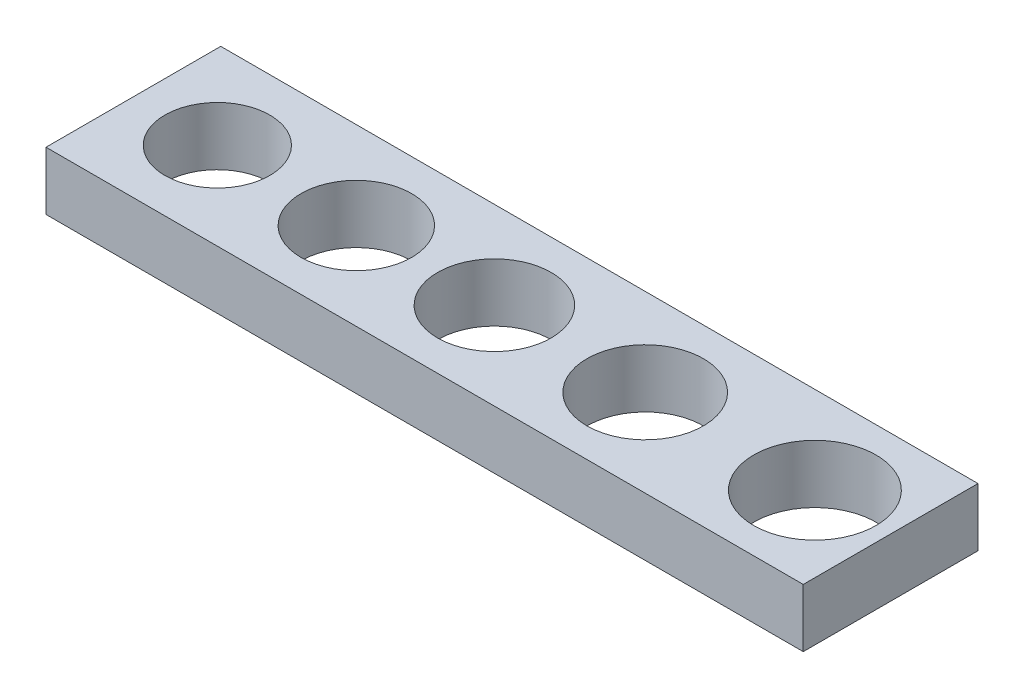
ISO-10303-21;
HEADER;
FILE_DESCRIPTION(('STEP AP214'),'2;1');
FILE_NAME('part.step','',(''),(''),'','','');
FILE_SCHEMA(('AUTOMOTIVE_DESIGN { 1 0 10303 214 1 1 1 1 }'));
ENDSEC;
DATA;
#1=APPLICATION_CONTEXT('core data for automotive mechanical design processes');
#2=APPLICATION_PROTOCOL_DEFINITION('international standard','automotive_design',2000,#1);
#3=PRODUCT_CONTEXT('',#1,'mechanical');
#4=PRODUCT('Part','Part','',(#3));
#5=PRODUCT_RELATED_PRODUCT_CATEGORY('part','',(#4));
#6=PRODUCT_DEFINITION_FORMATION('','',#4);
#7=PRODUCT_DEFINITION_CONTEXT('part definition',#1,'design');
#8=PRODUCT_DEFINITION('design','',#6,#7);
#9=PRODUCT_DEFINITION_SHAPE('','',#8);
#10=(LENGTH_UNIT() NAMED_UNIT(*) SI_UNIT(.MILLI.,.METRE.));
#11=(NAMED_UNIT(*) PLANE_ANGLE_UNIT() SI_UNIT($,.RADIAN.));
#12=(NAMED_UNIT(*) SI_UNIT($,.STERADIAN.) SOLID_ANGLE_UNIT());
#13=UNCERTAINTY_MEASURE_WITH_UNIT(LENGTH_MEASURE(1.E-05),#10,'distance_accuracy_value','');
#14=(GEOMETRIC_REPRESENTATION_CONTEXT(3) GLOBAL_UNCERTAINTY_ASSIGNED_CONTEXT((#13)) GLOBAL_UNIT_ASSIGNED_CONTEXT((#10,
#11,#12)) REPRESENTATION_CONTEXT('',''));
#15=CARTESIAN_POINT('',(0.,0.,0.));
#16=DIRECTION('',(0.,0.,1.));
#17=DIRECTION('',(1.,0.,0.));
#18=AXIS2_PLACEMENT_3D('',#15,#16,#17);
#19=CARTESIAN_POINT('',(32.5,5.,7.5));
#20=DIRECTION('',(-1.,0.,0.));
#21=DIRECTION('',(0.,0.,1.));
#22=AXIS2_PLACEMENT_3D('',#19,#20,#21);
#23=PLANE('',#22);
#24=DIRECTION('',(0.,0.,-1.));
#25=VECTOR('',#24,1.);
#26=CARTESIAN_POINT('',(32.5,0.,7.5));
#27=LINE('',#26,#25);
#28=CARTESIAN_POINT('',(32.5,0.,7.5));
#29=VERTEX_POINT('',#28);
#30=CARTESIAN_POINT('',(32.5,0.,-7.5));
#31=VERTEX_POINT('',#30);
#32=EDGE_CURVE('E107',#29,#31,#27,.T.);
#33=ORIENTED_EDGE('',*,*,#32,.T.);
#34=DIRECTION('',(0.,-1.,0.));
#35=VECTOR('',#34,1.);
#36=CARTESIAN_POINT('',(32.5,5.,-7.5));
#37=LINE('',#36,#35);
#38=CARTESIAN_POINT('',(32.5,5.,-7.5));
#39=VERTEX_POINT('',#38);
#40=EDGE_CURVE('E11',#39,#31,#37,.T.);
#41=ORIENTED_EDGE('',*,*,#40,.F.);
#42=DIRECTION('',(0.,0.,-1.));
#43=VECTOR('',#42,1.);
#44=CARTESIAN_POINT('',(32.5,5.,7.5));
#45=LINE('',#44,#43);
#46=CARTESIAN_POINT('',(32.5,5.,7.5));
#47=VERTEX_POINT('',#46);
#48=EDGE_CURVE('E91',#47,#39,#45,.T.);
#49=ORIENTED_EDGE('',*,*,#48,.F.);
#50=DIRECTION('',(0.,-1.,0.));
#51=VECTOR('',#50,1.);
#52=CARTESIAN_POINT('',(32.5,5.,7.5));
#53=LINE('',#52,#51);
#54=EDGE_CURVE('E103',#47,#29,#53,.T.);
#55=ORIENTED_EDGE('',*,*,#54,.T.);
#56=EDGE_LOOP('',(#33,#41,#49,#55));
#57=FACE_BOUND('',#56,.T.);
#58=ADVANCED_FACE('F39',(#57),#23,.F.);
#59=CARTESIAN_POINT('',(-32.5,5.,-7.5));
#60=DIRECTION('',(0.,0.,1.));
#61=DIRECTION('',(1.,0.,0.));
#62=AXIS2_PLACEMENT_3D('',#59,#60,#61);
#63=PLANE('',#62);
#64=DIRECTION('',(-1.,0.,0.));
#65=VECTOR('',#64,1.);
#66=CARTESIAN_POINT('',(-32.5,0.,-7.5));
#67=LINE('',#66,#65);
#68=CARTESIAN_POINT('',(-32.5,0.,-7.5));
#69=VERTEX_POINT('',#68);
#70=EDGE_CURVE('E96',#31,#69,#67,.T.);
#71=ORIENTED_EDGE('',*,*,#70,.T.);
#72=DIRECTION('',(0.,-1.,0.));
#73=VECTOR('',#72,1.);
#74=CARTESIAN_POINT('',(-32.5,5.,-7.5));
#75=LINE('',#74,#73);
#76=CARTESIAN_POINT('',(-32.5,5.,-7.5));
#77=VERTEX_POINT('',#76);
#78=EDGE_CURVE('E48',#77,#69,#75,.T.);
#79=ORIENTED_EDGE('',*,*,#78,.F.);
#80=DIRECTION('',(-1.,0.,0.));
#81=VECTOR('',#80,1.);
#82=CARTESIAN_POINT('',(-32.5,5.,-7.5));
#83=LINE('',#82,#81);
#84=EDGE_CURVE('E86',#39,#77,#83,.T.);
#85=ORIENTED_EDGE('',*,*,#84,.F.);
#86=ORIENTED_EDGE('',*,*,#40,.T.);
#87=EDGE_LOOP('',(#71,#79,#85,#86));
#88=FACE_BOUND('',#87,.T.);
#89=ADVANCED_FACE('F95',(#88),#63,.F.);
#90=CARTESIAN_POINT('',(-32.5,5.,7.5));
#91=DIRECTION('',(1.,0.,0.));
#92=DIRECTION('',(0.,0.,-1.));
#93=AXIS2_PLACEMENT_3D('',#90,#91,#92);
#94=PLANE('',#93);
#95=DIRECTION('',(0.,0.,1.));
#96=VECTOR('',#95,1.);
#97=CARTESIAN_POINT('',(-32.5,0.,7.5));
#98=LINE('',#97,#96);
#99=CARTESIAN_POINT('',(-32.5,0.,7.5));
#100=VERTEX_POINT('',#99);
#101=EDGE_CURVE('E73',#69,#100,#98,.T.);
#102=ORIENTED_EDGE('',*,*,#101,.T.);
#103=DIRECTION('',(0.,-1.,0.));
#104=VECTOR('',#103,1.);
#105=CARTESIAN_POINT('',(-32.5,5.,7.5));
#106=LINE('',#105,#104);
#107=CARTESIAN_POINT('',(-32.5,5.,7.5));
#108=VERTEX_POINT('',#107);
#109=EDGE_CURVE('E98',#108,#100,#106,.T.);
#110=ORIENTED_EDGE('',*,*,#109,.F.);
#111=DIRECTION('',(0.,0.,1.));
#112=VECTOR('',#111,1.);
#113=CARTESIAN_POINT('',(-32.5,5.,7.5));
#114=LINE('',#113,#112);
#115=EDGE_CURVE('E89',#77,#108,#114,.T.);
#116=ORIENTED_EDGE('',*,*,#115,.F.);
#117=ORIENTED_EDGE('',*,*,#78,.T.);
#118=EDGE_LOOP('',(#102,#110,#116,#117));
#119=FACE_BOUND('',#118,.T.);
#120=ADVANCED_FACE('F99',(#119),#94,.F.);
#121=CARTESIAN_POINT('',(-32.5,5.,7.5));
#122=DIRECTION('',(0.,0.,-1.));
#123=DIRECTION('',(-1.,0.,0.));
#124=AXIS2_PLACEMENT_3D('',#121,#122,#123);
#125=PLANE('',#124);
#126=DIRECTION('',(1.,0.,0.));
#127=VECTOR('',#126,1.);
#128=CARTESIAN_POINT('',(-32.5,0.,7.5));
#129=LINE('',#128,#127);
#130=EDGE_CURVE('E79',#100,#29,#129,.T.);
#131=ORIENTED_EDGE('',*,*,#130,.T.);
#132=ORIENTED_EDGE('',*,*,#54,.F.);
#133=DIRECTION('',(1.,0.,0.));
#134=VECTOR('',#133,1.);
#135=CARTESIAN_POINT('',(-32.5,5.,7.5));
#136=LINE('',#135,#134);
#137=EDGE_CURVE('E56',#108,#47,#136,.T.);
#138=ORIENTED_EDGE('',*,*,#137,.F.);
#139=ORIENTED_EDGE('',*,*,#109,.T.);
#140=EDGE_LOOP('',(#131,#132,#138,#139));
#141=FACE_BOUND('',#140,.T.);
#142=ADVANCED_FACE('F121',(#141),#125,.F.);
#143=CARTESIAN_POINT('',(0.,5.,0.));
#144=DIRECTION('',(0.,-1.,0.));
#145=DIRECTION('',(0.,0.,-1.));
#146=AXIS2_PLACEMENT_3D('',#143,#144,#145);
#147=PLANE('',#146);
#148=CARTESIAN_POINT('',(-1.5117982447761,5.,0.));
#149=DIRECTION('',(0.,1.,0.));
#150=DIRECTION('',(0.,0.,1.));
#151=AXIS2_PLACEMENT_3D('',#148,#149,#150);
#152=CIRCLE('',#151,4.875);
#153=CARTESIAN_POINT('',(-1.5117982447761,5.,4.875));
#154=VERTEX_POINT('',#153);
#155=EDGE_CURVE('E136',#154,#154,#152,.T.);
#156=ORIENTED_EDGE('',*,*,#155,.F.);
#157=EDGE_LOOP('',(#156));
#158=FACE_BOUND('',#157,.T.);
#159=CARTESIAN_POINT('',(-25.2916306805784,5.,0.));
#160=DIRECTION('',(0.,1.,0.));
#161=DIRECTION('',(0.,0.,1.));
#162=AXIS2_PLACEMENT_3D('',#159,#160,#161);
#163=CIRCLE('',#162,4.5);
#164=CARTESIAN_POINT('',(-25.2916306805784,5.,4.50000000000001));
#165=VERTEX_POINT('',#164);
#166=EDGE_CURVE('E144',#165,#165,#163,.T.);
#167=ORIENTED_EDGE('',*,*,#166,.F.);
#168=EDGE_LOOP('',(#167));
#169=FACE_BOUND('',#168,.T.);
#170=CARTESIAN_POINT('',(25.9987228955079,5.,0.));
#171=DIRECTION('',(0.,1.,0.));
#172=DIRECTION('',(0.,0.,1.));
#173=AXIS2_PLACEMENT_3D('',#170,#171,#172);
#174=CIRCLE('',#173,5.25);
#175=CARTESIAN_POINT('',(25.9987228955079,5.,5.25000000000001));
#176=VERTEX_POINT('',#175);
#177=EDGE_CURVE('E152',#176,#176,#174,.T.);
#178=ORIENTED_EDGE('',*,*,#177,.F.);
#179=EDGE_LOOP('',(#178));
#180=FACE_BOUND('',#179,.T.);
#181=CARTESIAN_POINT('',(11.4337771918787,5.,0.));
#182=DIRECTION('',(0.,1.,0.));
#183=DIRECTION('',(0.,0.,1.));
#184=AXIS2_PLACEMENT_3D('',#181,#182,#183);
#185=CIRCLE('',#184,5.);
#186=CARTESIAN_POINT('',(11.4337771918787,5.,5.00000000000001));
#187=VERTEX_POINT('',#186);
#188=EDGE_CURVE('E160',#187,#187,#185,.T.);
#189=ORIENTED_EDGE('',*,*,#188,.F.);
#190=EDGE_LOOP('',(#189));
#191=FACE_BOUND('',#190,.T.);
#192=CARTESIAN_POINT('',(-13.3624114157216,5.,0.));
#193=DIRECTION('',(0.,1.,0.));
#194=DIRECTION('',(0.,0.,1.));
#195=AXIS2_PLACEMENT_3D('',#192,#193,#194);
#196=CIRCLE('',#195,4.75);
#197=CARTESIAN_POINT('',(-13.3624114157216,5.,4.75000000000001));
#198=VERTEX_POINT('',#197);
#199=EDGE_CURVE('E128',#198,#198,#196,.T.);
#200=ORIENTED_EDGE('',*,*,#199,.F.);
#201=EDGE_LOOP('',(#200));
#202=FACE_BOUND('',#201,.T.);
#203=ORIENTED_EDGE('',*,*,#48,.T.);
#204=ORIENTED_EDGE('',*,*,#84,.T.);
#205=ORIENTED_EDGE('',*,*,#115,.T.);
#206=ORIENTED_EDGE('',*,*,#137,.T.);
#207=EDGE_LOOP('',(#203,#204,#205,#206));
#208=FACE_BOUND('',#207,.T.);
#209=ADVANCED_FACE('F87',(#158,#169,#180,#191,#202,#208),#147,.F.);
#210=CARTESIAN_POINT('',(0.,0.,0.));
#211=DIRECTION('',(0.,-1.,0.));
#212=DIRECTION('',(0.,0.,-1.));
#213=AXIS2_PLACEMENT_3D('',#210,#211,#212);
#214=PLANE('',#213);
#215=CARTESIAN_POINT('',(-1.5117982447761,0.,0.));
#216=DIRECTION('',(0.,1.,0.));
#217=DIRECTION('',(0.,0.,1.));
#218=AXIS2_PLACEMENT_3D('',#215,#216,#217);
#219=CIRCLE('',#218,4.875);
#220=CARTESIAN_POINT('',(-1.5117982447761,0.,4.875));
#221=VERTEX_POINT('',#220);
#222=EDGE_CURVE('E140',#221,#221,#219,.T.);
#223=ORIENTED_EDGE('',*,*,#222,.T.);
#224=EDGE_LOOP('',(#223));
#225=FACE_BOUND('',#224,.T.);
#226=CARTESIAN_POINT('',(-25.2916306805784,0.,0.));
#227=DIRECTION('',(0.,1.,0.));
#228=DIRECTION('',(0.,0.,1.));
#229=AXIS2_PLACEMENT_3D('',#226,#227,#228);
#230=CIRCLE('',#229,4.5);
#231=CARTESIAN_POINT('',(-25.2916306805784,0.,4.50000000000001));
#232=VERTEX_POINT('',#231);
#233=EDGE_CURVE('E148',#232,#232,#230,.T.);
#234=ORIENTED_EDGE('',*,*,#233,.T.);
#235=EDGE_LOOP('',(#234));
#236=FACE_BOUND('',#235,.T.);
#237=CARTESIAN_POINT('',(25.9987228955079,0.,0.));
#238=DIRECTION('',(0.,1.,0.));
#239=DIRECTION('',(0.,0.,1.));
#240=AXIS2_PLACEMENT_3D('',#237,#238,#239);
#241=CIRCLE('',#240,5.25);
#242=CARTESIAN_POINT('',(25.9987228955079,0.,5.25000000000001));
#243=VERTEX_POINT('',#242);
#244=EDGE_CURVE('E156',#243,#243,#241,.T.);
#245=ORIENTED_EDGE('',*,*,#244,.T.);
#246=EDGE_LOOP('',(#245));
#247=FACE_BOUND('',#246,.T.);
#248=CARTESIAN_POINT('',(11.4337771918787,0.,0.));
#249=DIRECTION('',(0.,1.,0.));
#250=DIRECTION('',(0.,0.,1.));
#251=AXIS2_PLACEMENT_3D('',#248,#249,#250);
#252=CIRCLE('',#251,5.);
#253=CARTESIAN_POINT('',(11.4337771918787,0.,5.00000000000001));
#254=VERTEX_POINT('',#253);
#255=EDGE_CURVE('E132',#254,#254,#252,.T.);
#256=ORIENTED_EDGE('',*,*,#255,.T.);
#257=EDGE_LOOP('',(#256));
#258=FACE_BOUND('',#257,.T.);
#259=CARTESIAN_POINT('',(-13.3624114157216,0.,0.));
#260=DIRECTION('',(0.,1.,0.));
#261=DIRECTION('',(0.,0.,1.));
#262=AXIS2_PLACEMENT_3D('',#259,#260,#261);
#263=CIRCLE('',#262,4.75);
#264=CARTESIAN_POINT('',(-13.3624114157216,0.,4.75000000000001));
#265=VERTEX_POINT('',#264);
#266=EDGE_CURVE('E111',#265,#265,#263,.T.);
#267=ORIENTED_EDGE('',*,*,#266,.T.);
#268=EDGE_LOOP('',(#267));
#269=FACE_BOUND('',#268,.T.);
#270=ORIENTED_EDGE('',*,*,#32,.F.);
#271=ORIENTED_EDGE('',*,*,#130,.F.);
#272=ORIENTED_EDGE('',*,*,#101,.F.);
#273=ORIENTED_EDGE('',*,*,#70,.F.);
#274=EDGE_LOOP('',(#270,#271,#272,#273));
#275=FACE_BOUND('',#274,.T.);
#276=ADVANCED_FACE('F124',(#225,#236,#247,#258,#269,#275),#214,.T.);
#277=CARTESIAN_POINT('',(-13.3624114157216,0.,0.));
#278=DIRECTION('',(0.,1.,0.));
#279=DIRECTION('',(0.,0.,1.));
#280=AXIS2_PLACEMENT_3D('',#277,#278,#279);
#281=CYLINDRICAL_SURFACE('',#280,4.75);
#282=ORIENTED_EDGE('',*,*,#266,.F.);
#283=EDGE_LOOP('',(#282));
#284=FACE_BOUND('',#283,.T.);
#285=ORIENTED_EDGE('',*,*,#199,.T.);
#286=EDGE_LOOP('',(#285));
#287=FACE_BOUND('',#286,.T.);
#288=ADVANCED_FACE('F174',(#284,#287),#281,.F.);
#289=CARTESIAN_POINT('',(11.4337771918787,0.,0.));
#290=DIRECTION('',(0.,1.,0.));
#291=DIRECTION('',(0.,0.,1.));
#292=AXIS2_PLACEMENT_3D('',#289,#290,#291);
#293=CYLINDRICAL_SURFACE('',#292,5.);
#294=ORIENTED_EDGE('',*,*,#255,.F.);
#295=EDGE_LOOP('',(#294));
#296=FACE_BOUND('',#295,.T.);
#297=ORIENTED_EDGE('',*,*,#188,.T.);
#298=EDGE_LOOP('',(#297));
#299=FACE_BOUND('',#298,.T.);
#300=ADVANCED_FACE('F170',(#296,#299),#293,.F.);
#301=CARTESIAN_POINT('',(25.9987228955079,0.,0.));
#302=DIRECTION('',(0.,1.,0.));
#303=DIRECTION('',(0.,0.,1.));
#304=AXIS2_PLACEMENT_3D('',#301,#302,#303);
#305=CYLINDRICAL_SURFACE('',#304,5.25);
#306=ORIENTED_EDGE('',*,*,#244,.F.);
#307=EDGE_LOOP('',(#306));
#308=FACE_BOUND('',#307,.T.);
#309=ORIENTED_EDGE('',*,*,#177,.T.);
#310=EDGE_LOOP('',(#309));
#311=FACE_BOUND('',#310,.T.);
#312=ADVANCED_FACE('F173',(#308,#311),#305,.F.);
#313=CARTESIAN_POINT('',(-25.2916306805784,0.,0.));
#314=DIRECTION('',(0.,1.,0.));
#315=DIRECTION('',(0.,0.,1.));
#316=AXIS2_PLACEMENT_3D('',#313,#314,#315);
#317=CYLINDRICAL_SURFACE('',#316,4.5);
#318=ORIENTED_EDGE('',*,*,#233,.F.);
#319=EDGE_LOOP('',(#318));
#320=FACE_BOUND('',#319,.T.);
#321=ORIENTED_EDGE('',*,*,#166,.T.);
#322=EDGE_LOOP('',(#321));
#323=FACE_BOUND('',#322,.T.);
#324=ADVANCED_FACE('F237',(#320,#323),#317,.F.);
#325=CARTESIAN_POINT('',(-1.5117982447761,0.,0.));
#326=DIRECTION('',(0.,1.,0.));
#327=DIRECTION('',(0.,0.,1.));
#328=AXIS2_PLACEMENT_3D('',#325,#326,#327);
#329=CYLINDRICAL_SURFACE('',#328,4.875);
#330=ORIENTED_EDGE('',*,*,#222,.F.);
#331=EDGE_LOOP('',(#330));
#332=FACE_BOUND('',#331,.T.);
#333=ORIENTED_EDGE('',*,*,#155,.T.);
#334=EDGE_LOOP('',(#333));
#335=FACE_BOUND('',#334,.T.);
#336=ADVANCED_FACE('F247',(#332,#335),#329,.F.);
#337=CLOSED_SHELL('',(#58,#89,#120,#142,#209,#276,#288,#300,#312,#324,#336));
#338=MANIFOLD_SOLID_BREP('B2',#337);
#339=ADVANCED_BREP_SHAPE_REPRESENTATION('',(#18,#338),#14);
#340=SHAPE_DEFINITION_REPRESENTATION(#9,#339);
ENDSEC;
END-ISO-10303-21;
